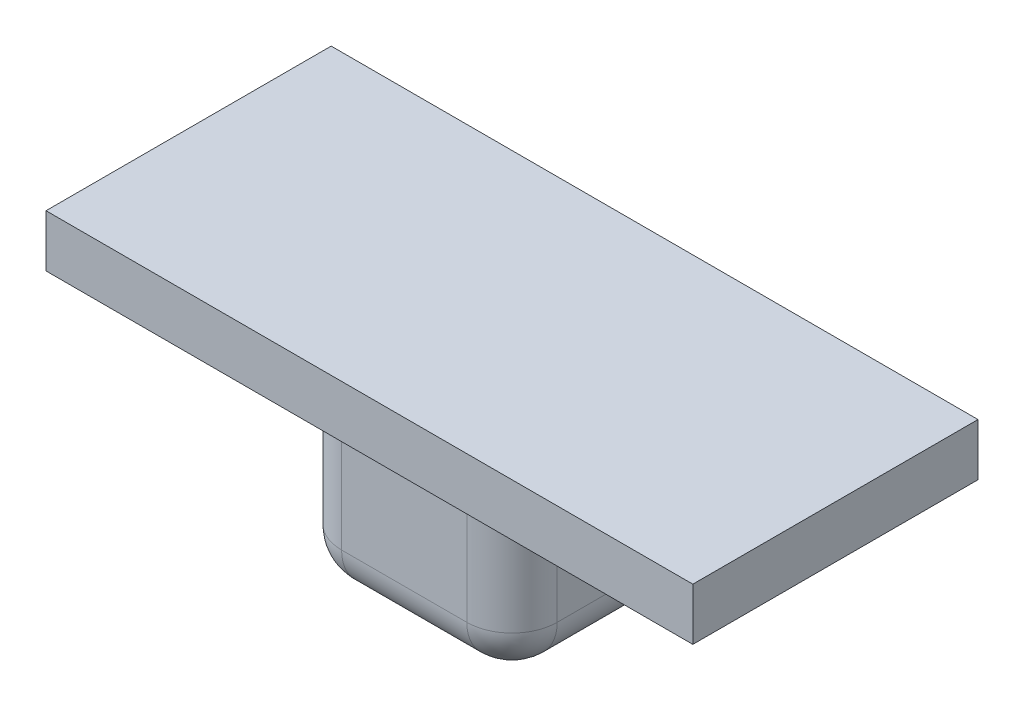
ISO-10303-21;
HEADER;
FILE_DESCRIPTION(('STEP AP214'),'2;1');
FILE_NAME('part.step','',(''),(''),'','','');
FILE_SCHEMA(('AUTOMOTIVE_DESIGN { 1 0 10303 214 1 1 1 1 }'));
ENDSEC;
DATA;
#1=APPLICATION_CONTEXT('core data for automotive mechanical design processes');
#2=APPLICATION_PROTOCOL_DEFINITION('international standard','automotive_design',2000,#1);
#3=PRODUCT_CONTEXT('',#1,'mechanical');
#4=PRODUCT('Part','Part','',(#3));
#5=PRODUCT_RELATED_PRODUCT_CATEGORY('part','',(#4));
#6=PRODUCT_DEFINITION_FORMATION('','',#4);
#7=PRODUCT_DEFINITION_CONTEXT('part definition',#1,'design');
#8=PRODUCT_DEFINITION('design','',#6,#7);
#9=PRODUCT_DEFINITION_SHAPE('','',#8);
#10=(LENGTH_UNIT() NAMED_UNIT(*) SI_UNIT(.MILLI.,.METRE.));
#11=(NAMED_UNIT(*) PLANE_ANGLE_UNIT() SI_UNIT($,.RADIAN.));
#12=(NAMED_UNIT(*) SI_UNIT($,.STERADIAN.) SOLID_ANGLE_UNIT());
#13=UNCERTAINTY_MEASURE_WITH_UNIT(LENGTH_MEASURE(1.E-05),#10,'distance_accuracy_value','');
#14=(GEOMETRIC_REPRESENTATION_CONTEXT(3) GLOBAL_UNCERTAINTY_ASSIGNED_CONTEXT((#13)) GLOBAL_UNIT_ASSIGNED_CONTEXT((#10,
#11,#12)) REPRESENTATION_CONTEXT('',''));
#15=CARTESIAN_POINT('',(0.,0.,0.));
#16=DIRECTION('',(0.,0.,1.));
#17=DIRECTION('',(1.,0.,0.));
#18=AXIS2_PLACEMENT_3D('',#15,#16,#17);
#19=CARTESIAN_POINT('',(0.,0.,0.));
#20=DIRECTION('',(0.,1.,0.));
#21=DIRECTION('',(0.,0.,1.));
#22=AXIS2_PLACEMENT_3D('',#19,#20,#21);
#23=PLANE('',#22);
#24=DIRECTION('',(0.,0.,1.));
#25=VECTOR('',#24,1.);
#26=CARTESIAN_POINT('',(-1.8,0.,0.));
#27=LINE('',#26,#25);
#28=CARTESIAN_POINT('',(-1.8,0.,1.8));
#29=VERTEX_POINT('',#28);
#30=CARTESIAN_POINT('',(-1.8,0.,-1.8));
#31=VERTEX_POINT('',#30);
#32=EDGE_CURVE('E265',#29,#31,#27,.F.);
#33=ORIENTED_EDGE('',*,*,#32,.T.);
#34=DIRECTION('',(-1.,0.,0.));
#35=VECTOR('',#34,1.);
#36=CARTESIAN_POINT('',(0.,0.,-1.8));
#37=LINE('',#36,#35);
#38=CARTESIAN_POINT('',(1.8,0.,-1.8));
#39=VERTEX_POINT('',#38);
#40=EDGE_CURVE('E270',#31,#39,#37,.F.);
#41=ORIENTED_EDGE('',*,*,#40,.T.);
#42=DIRECTION('',(0.,0.,-1.));
#43=VECTOR('',#42,1.);
#44=CARTESIAN_POINT('',(1.8,0.,0.));
#45=LINE('',#44,#43);
#46=CARTESIAN_POINT('',(1.8,0.,1.8));
#47=VERTEX_POINT('',#46);
#48=EDGE_CURVE('E60',#39,#47,#45,.F.);
#49=ORIENTED_EDGE('',*,*,#48,.T.);
#50=DIRECTION('',(1.,0.,0.));
#51=VECTOR('',#50,1.);
#52=CARTESIAN_POINT('',(0.,0.,1.8));
#53=LINE('',#52,#51);
#54=EDGE_CURVE('E267',#47,#29,#53,.F.);
#55=ORIENTED_EDGE('',*,*,#54,.T.);
#56=EDGE_LOOP('',(#33,#41,#49,#55));
#57=FACE_BOUND('',#56,.T.);
#58=DIRECTION('',(0.,0.,1.));
#59=VECTOR('',#58,1.);
#60=CARTESIAN_POINT('',(-1.6,0.,1.6));
#61=LINE('',#60,#59);
#62=CARTESIAN_POINT('',(-1.6,0.,-1.6));
#63=VERTEX_POINT('',#62);
#64=CARTESIAN_POINT('',(-1.6,0.,1.6));
#65=VERTEX_POINT('',#64);
#66=EDGE_CURVE('E189',#63,#65,#61,.T.);
#67=ORIENTED_EDGE('',*,*,#66,.T.);
#68=DIRECTION('',(1.,0.,0.));
#69=VECTOR('',#68,1.);
#70=CARTESIAN_POINT('',(1.6,0.,1.6));
#71=LINE('',#70,#69);
#72=CARTESIAN_POINT('',(1.6,0.,1.6));
#73=VERTEX_POINT('',#72);
#74=EDGE_CURVE('E192',#65,#73,#71,.T.);
#75=ORIENTED_EDGE('',*,*,#74,.T.);
#76=DIRECTION('',(0.,0.,-1.));
#77=VECTOR('',#76,1.);
#78=CARTESIAN_POINT('',(1.6,0.,1.6));
#79=LINE('',#78,#77);
#80=CARTESIAN_POINT('',(1.6,0.,-1.6));
#81=VERTEX_POINT('',#80);
#82=EDGE_CURVE('E214',#73,#81,#79,.T.);
#83=ORIENTED_EDGE('',*,*,#82,.T.);
#84=DIRECTION('',(-1.,0.,0.));
#85=VECTOR('',#84,1.);
#86=CARTESIAN_POINT('',(1.6,0.,-1.6));
#87=LINE('',#86,#85);
#88=EDGE_CURVE('E202',#81,#63,#87,.T.);
#89=ORIENTED_EDGE('',*,*,#88,.T.);
#90=EDGE_LOOP('',(#67,#75,#83,#89));
#91=FACE_BOUND('',#90,.T.);
#92=ADVANCED_FACE('F35',(#57,#91),#23,.F.);
#93=CARTESIAN_POINT('',(-3.1,5.,3.1));
#94=DIRECTION('',(1.,0.,0.));
#95=DIRECTION('',(0.,0.,-1.));
#96=AXIS2_PLACEMENT_3D('',#93,#94,#95);
#97=PLANE('',#96);
#98=DIRECTION('',(0.,0.,1.));
#99=VECTOR('',#98,1.);
#100=CARTESIAN_POINT('',(-3.1,5.,3.1));
#101=LINE('',#100,#99);
#102=CARTESIAN_POINT('',(-3.1,5.,-1.8));
#103=VERTEX_POINT('',#102);
#104=CARTESIAN_POINT('',(-3.1,5.,1.8));
#105=VERTEX_POINT('',#104);
#106=EDGE_CURVE('E228',#103,#105,#101,.T.);
#107=ORIENTED_EDGE('',*,*,#106,.F.);
#108=DIRECTION('',(0.,-1.,0.));
#109=VECTOR('',#108,1.);
#110=CARTESIAN_POINT('',(-3.1,5.,-1.8));
#111=LINE('',#110,#109);
#112=CARTESIAN_POINT('',(-3.1,1.3,-1.8));
#113=VERTEX_POINT('',#112);
#114=EDGE_CURVE('E263',#103,#113,#111,.T.);
#115=ORIENTED_EDGE('',*,*,#114,.T.);
#116=DIRECTION('',(0.,0.,1.));
#117=VECTOR('',#116,1.);
#118=CARTESIAN_POINT('',(-3.1,1.3,3.1));
#119=LINE('',#118,#117);
#120=CARTESIAN_POINT('',(-3.1,1.3,1.8));
#121=VERTEX_POINT('',#120);
#122=EDGE_CURVE('E259',#113,#121,#119,.T.);
#123=ORIENTED_EDGE('',*,*,#122,.T.);
#124=DIRECTION('',(0.,-1.,0.));
#125=VECTOR('',#124,1.);
#126=CARTESIAN_POINT('',(-3.1,5.,1.8));
#127=LINE('',#126,#125);
#128=EDGE_CURVE('E261',#121,#105,#127,.F.);
#129=ORIENTED_EDGE('',*,*,#128,.T.);
#130=EDGE_LOOP('',(#107,#115,#123,#129));
#131=FACE_BOUND('',#130,.T.);
#132=ADVANCED_FACE('F342',(#131),#97,.F.);
#133=CARTESIAN_POINT('',(3.1,5.,3.1));
#134=DIRECTION('',(0.,0.,-1.));
#135=DIRECTION('',(-1.,0.,0.));
#136=AXIS2_PLACEMENT_3D('',#133,#134,#135);
#137=PLANE('',#136);
#138=DIRECTION('',(1.,0.,0.));
#139=VECTOR('',#138,1.);
#140=CARTESIAN_POINT('',(3.1,1.3,3.1));
#141=LINE('',#140,#139);
#142=CARTESIAN_POINT('',(-1.8,1.3,3.1));
#143=VERTEX_POINT('',#142);
#144=CARTESIAN_POINT('',(1.8,1.3,3.1));
#145=VERTEX_POINT('',#144);
#146=EDGE_CURVE('E253',#143,#145,#141,.T.);
#147=ORIENTED_EDGE('',*,*,#146,.T.);
#148=DIRECTION('',(0.,-1.,0.));
#149=VECTOR('',#148,1.);
#150=CARTESIAN_POINT('',(1.8,5.,3.1));
#151=LINE('',#150,#149);
#152=CARTESIAN_POINT('',(1.8,5.,3.1));
#153=VERTEX_POINT('',#152);
#154=EDGE_CURVE('E257',#145,#153,#151,.F.);
#155=ORIENTED_EDGE('',*,*,#154,.T.);
#156=DIRECTION('',(1.,0.,0.));
#157=VECTOR('',#156,1.);
#158=CARTESIAN_POINT('',(3.1,5.,3.1));
#159=LINE('',#158,#157);
#160=CARTESIAN_POINT('',(-1.8,5.,3.1));
#161=VERTEX_POINT('',#160);
#162=EDGE_CURVE('E231',#161,#153,#159,.T.);
#163=ORIENTED_EDGE('',*,*,#162,.F.);
#164=DIRECTION('',(0.,-1.,0.));
#165=VECTOR('',#164,1.);
#166=CARTESIAN_POINT('',(-1.8,5.,3.1));
#167=LINE('',#166,#165);
#168=EDGE_CURVE('E255',#161,#143,#167,.T.);
#169=ORIENTED_EDGE('',*,*,#168,.T.);
#170=EDGE_LOOP('',(#147,#155,#163,#169));
#171=FACE_BOUND('',#170,.T.);
#172=ADVANCED_FACE('F347',(#171),#137,.F.);
#173=CARTESIAN_POINT('',(3.1,5.,3.1));
#174=DIRECTION('',(-1.,0.,0.));
#175=DIRECTION('',(0.,0.,1.));
#176=AXIS2_PLACEMENT_3D('',#173,#174,#175);
#177=PLANE('',#176);
#178=DIRECTION('',(0.,0.,-1.));
#179=VECTOR('',#178,1.);
#180=CARTESIAN_POINT('',(3.1,1.3,3.1));
#181=LINE('',#180,#179);
#182=CARTESIAN_POINT('',(3.1,1.3,1.8));
#183=VERTEX_POINT('',#182);
#184=CARTESIAN_POINT('',(3.1,1.3,-1.8));
#185=VERTEX_POINT('',#184);
#186=EDGE_CURVE('E247',#183,#185,#181,.T.);
#187=ORIENTED_EDGE('',*,*,#186,.T.);
#188=DIRECTION('',(0.,-1.,0.));
#189=VECTOR('',#188,1.);
#190=CARTESIAN_POINT('',(3.1,5.,-1.8));
#191=LINE('',#190,#189);
#192=CARTESIAN_POINT('',(3.1,5.,-1.8));
#193=VERTEX_POINT('',#192);
#194=EDGE_CURVE('E251',#185,#193,#191,.F.);
#195=ORIENTED_EDGE('',*,*,#194,.T.);
#196=DIRECTION('',(0.,0.,-1.));
#197=VECTOR('',#196,1.);
#198=CARTESIAN_POINT('',(3.1,5.,3.1));
#199=LINE('',#198,#197);
#200=CARTESIAN_POINT('',(3.1,5.,1.8));
#201=VERTEX_POINT('',#200);
#202=EDGE_CURVE('E234',#201,#193,#199,.T.);
#203=ORIENTED_EDGE('',*,*,#202,.F.);
#204=DIRECTION('',(0.,-1.,0.));
#205=VECTOR('',#204,1.);
#206=CARTESIAN_POINT('',(3.1,5.,1.8));
#207=LINE('',#206,#205);
#208=EDGE_CURVE('E249',#201,#183,#207,.T.);
#209=ORIENTED_EDGE('',*,*,#208,.T.);
#210=EDGE_LOOP('',(#187,#195,#203,#209));
#211=FACE_BOUND('',#210,.T.);
#212=ADVANCED_FACE('F358',(#211),#177,.F.);
#213=CARTESIAN_POINT('',(3.1,5.,-3.1));
#214=DIRECTION('',(0.,0.,1.));
#215=DIRECTION('',(1.,0.,0.));
#216=AXIS2_PLACEMENT_3D('',#213,#214,#215);
#217=PLANE('',#216);
#218=DIRECTION('',(-1.,0.,0.));
#219=VECTOR('',#218,1.);
#220=CARTESIAN_POINT('',(3.1,5.,-3.1));
#221=LINE('',#220,#219);
#222=CARTESIAN_POINT('',(1.8,5.,-3.1));
#223=VERTEX_POINT('',#222);
#224=CARTESIAN_POINT('',(-1.8,5.,-3.1));
#225=VERTEX_POINT('',#224);
#226=EDGE_CURVE('E237',#223,#225,#221,.T.);
#227=ORIENTED_EDGE('',*,*,#226,.F.);
#228=DIRECTION('',(0.,-1.,0.));
#229=VECTOR('',#228,1.);
#230=CARTESIAN_POINT('',(1.8,5.,-3.1));
#231=LINE('',#230,#229);
#232=CARTESIAN_POINT('',(1.8,1.3,-3.1));
#233=VERTEX_POINT('',#232);
#234=EDGE_CURVE('E244',#223,#233,#231,.T.);
#235=ORIENTED_EDGE('',*,*,#234,.T.);
#236=DIRECTION('',(-1.,0.,0.));
#237=VECTOR('',#236,1.);
#238=CARTESIAN_POINT('',(3.1,1.3,-3.1));
#239=LINE('',#238,#237);
#240=CARTESIAN_POINT('',(-1.8,1.3,-3.1));
#241=VERTEX_POINT('',#240);
#242=EDGE_CURVE('E240',#233,#241,#239,.T.);
#243=ORIENTED_EDGE('',*,*,#242,.T.);
#244=DIRECTION('',(0.,-1.,0.));
#245=VECTOR('',#244,1.);
#246=CARTESIAN_POINT('',(-1.8,5.,-3.1));
#247=LINE('',#246,#245);
#248=EDGE_CURVE('E242',#241,#225,#247,.F.);
#249=ORIENTED_EDGE('',*,*,#248,.T.);
#250=EDGE_LOOP('',(#227,#235,#243,#249));
#251=FACE_BOUND('',#250,.T.);
#252=ADVANCED_FACE('F355',(#251),#217,.F.);
#253=CARTESIAN_POINT('',(-1.6,5.,1.6));
#254=DIRECTION('',(1.,0.,0.));
#255=DIRECTION('',(0.,0.,-1.));
#256=AXIS2_PLACEMENT_3D('',#253,#254,#255);
#257=PLANE('',#256);
#258=ORIENTED_EDGE('',*,*,#66,.F.);
#259=DIRECTION('',(0.,-1.,0.));
#260=VECTOR('',#259,1.);
#261=CARTESIAN_POINT('',(-1.6,5.,-1.6));
#262=LINE('',#261,#260);
#263=CARTESIAN_POINT('',(-1.6,5.,-1.6));
#264=VERTEX_POINT('',#263);
#265=EDGE_CURVE('E210',#264,#63,#262,.T.);
#266=ORIENTED_EDGE('',*,*,#265,.F.);
#267=DIRECTION('',(0.,0.,1.));
#268=VECTOR('',#267,1.);
#269=CARTESIAN_POINT('',(-1.6,5.,1.6));
#270=LINE('',#269,#268);
#271=CARTESIAN_POINT('',(-1.6,5.,1.6));
#272=VERTEX_POINT('',#271);
#273=EDGE_CURVE('E198',#264,#272,#270,.T.);
#274=ORIENTED_EDGE('',*,*,#273,.T.);
#275=DIRECTION('',(0.,-1.,0.));
#276=VECTOR('',#275,1.);
#277=CARTESIAN_POINT('',(-1.6,5.,1.6));
#278=LINE('',#277,#276);
#279=EDGE_CURVE('E225',#272,#65,#278,.T.);
#280=ORIENTED_EDGE('',*,*,#279,.T.);
#281=EDGE_LOOP('',(#258,#266,#274,#280));
#282=FACE_BOUND('',#281,.T.);
#283=ADVANCED_FACE('F353',(#282),#257,.T.);
#284=CARTESIAN_POINT('',(1.6,5.,1.6));
#285=DIRECTION('',(0.,0.,-1.));
#286=DIRECTION('',(-1.,0.,0.));
#287=AXIS2_PLACEMENT_3D('',#284,#285,#286);
#288=PLANE('',#287);
#289=ORIENTED_EDGE('',*,*,#74,.F.);
#290=ORIENTED_EDGE('',*,*,#279,.F.);
#291=DIRECTION('',(1.,0.,0.));
#292=VECTOR('',#291,1.);
#293=CARTESIAN_POINT('',(1.6,5.,1.6));
#294=LINE('',#293,#292);
#295=CARTESIAN_POINT('',(1.6,5.,1.6));
#296=VERTEX_POINT('',#295);
#297=EDGE_CURVE('E201',#272,#296,#294,.T.);
#298=ORIENTED_EDGE('',*,*,#297,.T.);
#299=DIRECTION('',(0.,-1.,0.));
#300=VECTOR('',#299,1.);
#301=CARTESIAN_POINT('',(1.6,5.,1.6));
#302=LINE('',#301,#300);
#303=EDGE_CURVE('E223',#296,#73,#302,.T.);
#304=ORIENTED_EDGE('',*,*,#303,.T.);
#305=EDGE_LOOP('',(#289,#290,#298,#304));
#306=FACE_BOUND('',#305,.T.);
#307=ADVANCED_FACE('F562',(#306),#288,.T.);
#308=CARTESIAN_POINT('',(1.6,5.,1.6));
#309=DIRECTION('',(-1.,0.,0.));
#310=DIRECTION('',(0.,0.,1.));
#311=AXIS2_PLACEMENT_3D('',#308,#309,#310);
#312=PLANE('',#311);
#313=ORIENTED_EDGE('',*,*,#82,.F.);
#314=ORIENTED_EDGE('',*,*,#303,.F.);
#315=DIRECTION('',(0.,0.,-1.));
#316=VECTOR('',#315,1.);
#317=CARTESIAN_POINT('',(1.6,5.,1.6));
#318=LINE('',#317,#316);
#319=CARTESIAN_POINT('',(1.6,5.,-1.6));
#320=VERTEX_POINT('',#319);
#321=EDGE_CURVE('E205',#296,#320,#318,.T.);
#322=ORIENTED_EDGE('',*,*,#321,.T.);
#323=DIRECTION('',(0.,-1.,0.));
#324=VECTOR('',#323,1.);
#325=CARTESIAN_POINT('',(1.6,5.,-1.6));
#326=LINE('',#325,#324);
#327=EDGE_CURVE('E221',#320,#81,#326,.T.);
#328=ORIENTED_EDGE('',*,*,#327,.T.);
#329=EDGE_LOOP('',(#313,#314,#322,#328));
#330=FACE_BOUND('',#329,.T.);
#331=ADVANCED_FACE('F568',(#330),#312,.T.);
#332=CARTESIAN_POINT('',(1.6,5.,-1.6));
#333=DIRECTION('',(0.,0.,1.));
#334=DIRECTION('',(1.,0.,0.));
#335=AXIS2_PLACEMENT_3D('',#332,#333,#334);
#336=PLANE('',#335);
#337=ORIENTED_EDGE('',*,*,#88,.F.);
#338=ORIENTED_EDGE('',*,*,#327,.F.);
#339=DIRECTION('',(-1.,0.,0.));
#340=VECTOR('',#339,1.);
#341=CARTESIAN_POINT('',(1.6,5.,-1.6));
#342=LINE('',#341,#340);
#343=EDGE_CURVE('E208',#320,#264,#342,.T.);
#344=ORIENTED_EDGE('',*,*,#343,.T.);
#345=ORIENTED_EDGE('',*,*,#265,.T.);
#346=EDGE_LOOP('',(#337,#338,#344,#345));
#347=FACE_BOUND('',#346,.T.);
#348=ADVANCED_FACE('F443',(#347),#336,.T.);
#349=CARTESIAN_POINT('',(0.,5.,0.));
#350=DIRECTION('',(0.,1.,0.));
#351=DIRECTION('',(0.,0.,1.));
#352=AXIS2_PLACEMENT_3D('',#349,#350,#351);
#353=PLANE('',#352);
#354=ORIENTED_EDGE('',*,*,#273,.F.);
#355=ORIENTED_EDGE('',*,*,#343,.F.);
#356=ORIENTED_EDGE('',*,*,#321,.F.);
#357=ORIENTED_EDGE('',*,*,#297,.F.);
#358=EDGE_LOOP('',(#354,#355,#356,#357));
#359=FACE_BOUND('',#358,.T.);
#360=ADVANCED_FACE('F436',(#359),#353,.F.);
#361=DIRECTION('',(0.,0.,1.));
#362=VECTOR('',#361,1.);
#363=CARTESIAN_POINT('',(-9.3,5.,4.1));
#364=LINE('',#363,#362);
#365=CARTESIAN_POINT('',(-9.3,5.,-4.1));
#366=VERTEX_POINT('',#365);
#367=CARTESIAN_POINT('',(-9.3,5.,4.1));
#368=VERTEX_POINT('',#367);
#369=EDGE_CURVE('E188',#366,#368,#364,.T.);
#370=ORIENTED_EDGE('',*,*,#369,.F.);
#371=DIRECTION('',(-1.,0.,0.));
#372=VECTOR('',#371,1.);
#373=CARTESIAN_POINT('',(9.3,5.,-4.1));
#374=LINE('',#373,#372);
#375=CARTESIAN_POINT('',(9.3,5.,-4.1));
#376=VERTEX_POINT('',#375);
#377=EDGE_CURVE('E184',#376,#366,#374,.T.);
#378=ORIENTED_EDGE('',*,*,#377,.F.);
#379=DIRECTION('',(0.,0.,-1.));
#380=VECTOR('',#379,1.);
#381=CARTESIAN_POINT('',(9.3,5.,4.1));
#382=LINE('',#381,#380);
#383=CARTESIAN_POINT('',(9.3,5.,4.1));
#384=VERTEX_POINT('',#383);
#385=EDGE_CURVE('E314',#384,#376,#382,.T.);
#386=ORIENTED_EDGE('',*,*,#385,.F.);
#387=DIRECTION('',(1.,0.,0.));
#388=VECTOR('',#387,1.);
#389=CARTESIAN_POINT('',(9.3,5.,4.1));
#390=LINE('',#389,#388);
#391=EDGE_CURVE('E312',#368,#384,#390,.T.);
#392=ORIENTED_EDGE('',*,*,#391,.F.);
#393=EDGE_LOOP('',(#370,#378,#386,#392));
#394=FACE_BOUND('',#393,.T.);
#395=ORIENTED_EDGE('',*,*,#202,.T.);
#396=CARTESIAN_POINT('',(1.8,5.,-1.8));
#397=DIRECTION('',(0.,1.,0.));
#398=DIRECTION('',(0.,0.,1.));
#399=AXIS2_PLACEMENT_3D('',#396,#397,#398);
#400=CIRCLE('',#399,1.3);
#401=EDGE_CURVE('E272',#193,#223,#400,.T.);
#402=ORIENTED_EDGE('',*,*,#401,.T.);
#403=ORIENTED_EDGE('',*,*,#226,.T.);
#404=CARTESIAN_POINT('',(-1.8,5.,-1.8));
#405=DIRECTION('',(0.,1.,0.));
#406=DIRECTION('',(0.,0.,1.));
#407=AXIS2_PLACEMENT_3D('',#404,#405,#406);
#408=CIRCLE('',#407,1.3);
#409=EDGE_CURVE('E44',#225,#103,#408,.T.);
#410=ORIENTED_EDGE('',*,*,#409,.T.);
#411=ORIENTED_EDGE('',*,*,#106,.T.);
#412=CARTESIAN_POINT('',(-1.8,5.,1.8));
#413=DIRECTION('',(0.,1.,0.));
#414=DIRECTION('',(0.,0.,1.));
#415=AXIS2_PLACEMENT_3D('',#412,#413,#414);
#416=CIRCLE('',#415,1.3);
#417=EDGE_CURVE('E11',#105,#161,#416,.T.);
#418=ORIENTED_EDGE('',*,*,#417,.T.);
#419=ORIENTED_EDGE('',*,*,#162,.T.);
#420=CARTESIAN_POINT('',(1.8,5.,1.8));
#421=DIRECTION('',(0.,1.,0.));
#422=DIRECTION('',(0.,0.,1.));
#423=AXIS2_PLACEMENT_3D('',#420,#421,#422);
#424=CIRCLE('',#423,1.3);
#425=EDGE_CURVE('E274',#153,#201,#424,.T.);
#426=ORIENTED_EDGE('',*,*,#425,.T.);
#427=EDGE_LOOP('',(#395,#402,#403,#410,#411,#418,#419,#426));
#428=FACE_BOUND('',#427,.T.);
#429=ADVANCED_FACE('F330',(#394,#428),#353,.F.);
#430=CARTESIAN_POINT('',(-9.3,6.5,4.1));
#431=DIRECTION('',(1.,0.,0.));
#432=DIRECTION('',(0.,0.,-1.));
#433=AXIS2_PLACEMENT_3D('',#430,#431,#432);
#434=PLANE('',#433);
#435=ORIENTED_EDGE('',*,*,#369,.T.);
#436=DIRECTION('',(0.,-1.,0.));
#437=VECTOR('',#436,1.);
#438=CARTESIAN_POINT('',(-9.3,6.5,4.1));
#439=LINE('',#438,#437);
#440=CARTESIAN_POINT('',(-9.3,6.5,4.1));
#441=VERTEX_POINT('',#440);
#442=EDGE_CURVE('E168',#441,#368,#439,.T.);
#443=ORIENTED_EDGE('',*,*,#442,.F.);
#444=DIRECTION('',(0.,0.,1.));
#445=VECTOR('',#444,1.);
#446=CARTESIAN_POINT('',(-9.3,6.5,4.1));
#447=LINE('',#446,#445);
#448=CARTESIAN_POINT('',(-9.3,6.5,-4.1));
#449=VERTEX_POINT('',#448);
#450=EDGE_CURVE('E175',#449,#441,#447,.T.);
#451=ORIENTED_EDGE('',*,*,#450,.F.);
#452=DIRECTION('',(0.,-1.,0.));
#453=VECTOR('',#452,1.);
#454=CARTESIAN_POINT('',(-9.3,6.5,-4.1));
#455=LINE('',#454,#453);
#456=EDGE_CURVE('E321',#449,#366,#455,.T.);
#457=ORIENTED_EDGE('',*,*,#456,.T.);
#458=EDGE_LOOP('',(#435,#443,#451,#457));
#459=FACE_BOUND('',#458,.T.);
#460=ADVANCED_FACE('F186',(#459),#434,.F.);
#461=CARTESIAN_POINT('',(9.3,6.5,4.1));
#462=DIRECTION('',(0.,0.,-1.));
#463=DIRECTION('',(-1.,0.,0.));
#464=AXIS2_PLACEMENT_3D('',#461,#462,#463);
#465=PLANE('',#464);
#466=ORIENTED_EDGE('',*,*,#391,.T.);
#467=DIRECTION('',(0.,-1.,0.));
#468=VECTOR('',#467,1.);
#469=CARTESIAN_POINT('',(9.3,6.5,4.1));
#470=LINE('',#469,#468);
#471=CARTESIAN_POINT('',(9.3,6.5,4.1));
#472=VERTEX_POINT('',#471);
#473=EDGE_CURVE('E171',#472,#384,#470,.T.);
#474=ORIENTED_EDGE('',*,*,#473,.F.);
#475=DIRECTION('',(1.,0.,0.));
#476=VECTOR('',#475,1.);
#477=CARTESIAN_POINT('',(9.3,6.5,4.1));
#478=LINE('',#477,#476);
#479=EDGE_CURVE('E164',#441,#472,#478,.T.);
#480=ORIENTED_EDGE('',*,*,#479,.F.);
#481=ORIENTED_EDGE('',*,*,#442,.T.);
#482=EDGE_LOOP('',(#466,#474,#480,#481));
#483=FACE_BOUND('',#482,.T.);
#484=ADVANCED_FACE('F166',(#483),#465,.F.);
#485=CARTESIAN_POINT('',(9.3,6.5,4.1));
#486=DIRECTION('',(-1.,0.,0.));
#487=DIRECTION('',(0.,0.,1.));
#488=AXIS2_PLACEMENT_3D('',#485,#486,#487);
#489=PLANE('',#488);
#490=ORIENTED_EDGE('',*,*,#385,.T.);
#491=DIRECTION('',(0.,-1.,0.));
#492=VECTOR('',#491,1.);
#493=CARTESIAN_POINT('',(9.3,6.5,-4.1));
#494=LINE('',#493,#492);
#495=CARTESIAN_POINT('',(9.3,6.5,-4.1));
#496=VERTEX_POINT('',#495);
#497=EDGE_CURVE('E194',#496,#376,#494,.T.);
#498=ORIENTED_EDGE('',*,*,#497,.F.);
#499=DIRECTION('',(0.,0.,-1.));
#500=VECTOR('',#499,1.);
#501=CARTESIAN_POINT('',(9.3,6.5,4.1));
#502=LINE('',#501,#500);
#503=EDGE_CURVE('E174',#472,#496,#502,.T.);
#504=ORIENTED_EDGE('',*,*,#503,.F.);
#505=ORIENTED_EDGE('',*,*,#473,.T.);
#506=EDGE_LOOP('',(#490,#498,#504,#505));
#507=FACE_BOUND('',#506,.T.);
#508=ADVANCED_FACE('F332',(#507),#489,.F.);
#509=CARTESIAN_POINT('',(9.3,6.5,-4.1));
#510=DIRECTION('',(0.,0.,1.));
#511=DIRECTION('',(1.,0.,0.));
#512=AXIS2_PLACEMENT_3D('',#509,#510,#511);
#513=PLANE('',#512);
#514=ORIENTED_EDGE('',*,*,#377,.T.);
#515=ORIENTED_EDGE('',*,*,#456,.F.);
#516=DIRECTION('',(-1.,0.,0.));
#517=VECTOR('',#516,1.);
#518=CARTESIAN_POINT('',(9.3,6.5,-4.1));
#519=LINE('',#518,#517);
#520=EDGE_CURVE('E180',#496,#449,#519,.T.);
#521=ORIENTED_EDGE('',*,*,#520,.F.);
#522=ORIENTED_EDGE('',*,*,#497,.T.);
#523=EDGE_LOOP('',(#514,#515,#521,#522));
#524=FACE_BOUND('',#523,.T.);
#525=ADVANCED_FACE('F326',(#524),#513,.F.);
#526=CARTESIAN_POINT('',(0.,6.5,0.));
#527=DIRECTION('',(0.,1.,0.));
#528=DIRECTION('',(0.,0.,1.));
#529=AXIS2_PLACEMENT_3D('',#526,#527,#528);
#530=PLANE('',#529);
#531=ORIENTED_EDGE('',*,*,#450,.T.);
#532=ORIENTED_EDGE('',*,*,#479,.T.);
#533=ORIENTED_EDGE('',*,*,#503,.T.);
#534=ORIENTED_EDGE('',*,*,#520,.T.);
#535=EDGE_LOOP('',(#531,#532,#533,#534));
#536=FACE_BOUND('',#535,.T.);
#537=ADVANCED_FACE('F178',(#536),#530,.T.);
#538=CARTESIAN_POINT('',(-1.8,5.,1.8));
#539=DIRECTION('',(0.,-1.,0.));
#540=DIRECTION('',(0.,0.,-1.));
#541=AXIS2_PLACEMENT_3D('',#538,#539,#540);
#542=CYLINDRICAL_SURFACE('',#541,1.3);
#543=CARTESIAN_POINT('',(-1.8,1.3,1.8));
#544=DIRECTION('',(0.,-1.,0.));
#545=DIRECTION('',(0.,0.,-1.));
#546=AXIS2_PLACEMENT_3D('',#543,#544,#545);
#547=CIRCLE('',#546,1.3);
#548=EDGE_CURVE('E39',#143,#121,#547,.T.);
#549=ORIENTED_EDGE('',*,*,#548,.F.);
#550=ORIENTED_EDGE('',*,*,#168,.F.);
#551=ORIENTED_EDGE('',*,*,#417,.F.);
#552=ORIENTED_EDGE('',*,*,#128,.F.);
#553=EDGE_LOOP('',(#549,#550,#551,#552));
#554=FACE_BOUND('',#553,.T.);
#555=ADVANCED_FACE('F37',(#554),#542,.T.);
#556=CARTESIAN_POINT('',(-1.8,1.3,1.8));
#557=DIRECTION('',(0.,0.,1.));
#558=DIRECTION('',(1.,0.,0.));
#559=AXIS2_PLACEMENT_3D('',#556,#557,#558);
#560=SPHERICAL_SURFACE('',#559,1.3);
#561=CARTESIAN_POINT('',(-1.8,1.3,1.8));
#562=DIRECTION('',(-1.,0.,0.));
#563=DIRECTION('',(0.,0.,1.));
#564=AXIS2_PLACEMENT_3D('',#561,#562,#563);
#565=CIRCLE('',#564,1.3);
#566=EDGE_CURVE('E300',#143,#29,#565,.F.);
#567=ORIENTED_EDGE('',*,*,#566,.F.);
#568=ORIENTED_EDGE('',*,*,#548,.T.);
#569=CARTESIAN_POINT('',(-1.8,1.3,1.8));
#570=DIRECTION('',(0.,0.,1.));
#571=DIRECTION('',(1.,0.,0.));
#572=AXIS2_PLACEMENT_3D('',#569,#570,#571);
#573=CIRCLE('',#572,1.3);
#574=EDGE_CURVE('E302',#29,#121,#573,.F.);
#575=ORIENTED_EDGE('',*,*,#574,.F.);
#576=EDGE_LOOP('',(#567,#568,#575));
#577=FACE_BOUND('',#576,.T.);
#578=ADVANCED_FACE('F402',(#577),#560,.T.);
#579=CARTESIAN_POINT('',(-1.8,5.,-1.8));
#580=DIRECTION('',(0.,-1.,0.));
#581=DIRECTION('',(0.,0.,-1.));
#582=AXIS2_PLACEMENT_3D('',#579,#580,#581);
#583=CYLINDRICAL_SURFACE('',#582,1.3);
#584=ORIENTED_EDGE('',*,*,#409,.F.);
#585=ORIENTED_EDGE('',*,*,#248,.F.);
#586=CARTESIAN_POINT('',(-1.8,1.3,-1.8));
#587=DIRECTION('',(0.,-1.,0.));
#588=DIRECTION('',(0.,0.,-1.));
#589=AXIS2_PLACEMENT_3D('',#586,#587,#588);
#590=CIRCLE('',#589,1.3);
#591=EDGE_CURVE('E297',#113,#241,#590,.T.);
#592=ORIENTED_EDGE('',*,*,#591,.F.);
#593=ORIENTED_EDGE('',*,*,#114,.F.);
#594=EDGE_LOOP('',(#584,#585,#592,#593));
#595=FACE_BOUND('',#594,.T.);
#596=ADVANCED_FACE('F400',(#595),#583,.T.);
#597=CARTESIAN_POINT('',(-1.8,1.3,3.1));
#598=DIRECTION('',(0.,0.,1.));
#599=DIRECTION('',(1.,0.,0.));
#600=AXIS2_PLACEMENT_3D('',#597,#598,#599);
#601=CYLINDRICAL_SURFACE('',#600,1.3);
#602=ORIENTED_EDGE('',*,*,#574,.T.);
#603=ORIENTED_EDGE('',*,*,#122,.F.);
#604=CARTESIAN_POINT('',(-1.8,1.3,-1.8));
#605=DIRECTION('',(0.,0.,-1.));
#606=DIRECTION('',(-1.,0.,0.));
#607=AXIS2_PLACEMENT_3D('',#604,#605,#606);
#608=CIRCLE('',#607,1.3);
#609=EDGE_CURVE('E294',#31,#113,#608,.T.);
#610=ORIENTED_EDGE('',*,*,#609,.F.);
#611=ORIENTED_EDGE('',*,*,#32,.F.);
#612=EDGE_LOOP('',(#602,#603,#610,#611));
#613=FACE_BOUND('',#612,.T.);
#614=ADVANCED_FACE('F396',(#613),#601,.T.);
#615=CARTESIAN_POINT('',(3.1,1.3,1.8));
#616=DIRECTION('',(1.,0.,0.));
#617=DIRECTION('',(0.,0.,-1.));
#618=AXIS2_PLACEMENT_3D('',#615,#616,#617);
#619=CYLINDRICAL_SURFACE('',#618,1.3);
#620=ORIENTED_EDGE('',*,*,#566,.T.);
#621=ORIENTED_EDGE('',*,*,#54,.F.);
#622=CARTESIAN_POINT('',(1.8,1.3,1.8));
#623=DIRECTION('',(1.,0.,0.));
#624=DIRECTION('',(0.,0.,-1.));
#625=AXIS2_PLACEMENT_3D('',#622,#623,#624);
#626=CIRCLE('',#625,1.3);
#627=EDGE_CURVE('E291',#145,#47,#626,.T.);
#628=ORIENTED_EDGE('',*,*,#627,.F.);
#629=ORIENTED_EDGE('',*,*,#146,.F.);
#630=EDGE_LOOP('',(#620,#621,#628,#629));
#631=FACE_BOUND('',#630,.T.);
#632=ADVANCED_FACE('F392',(#631),#619,.T.);
#633=CARTESIAN_POINT('',(1.8,5.,1.8));
#634=DIRECTION('',(0.,-1.,0.));
#635=DIRECTION('',(0.,0.,-1.));
#636=AXIS2_PLACEMENT_3D('',#633,#634,#635);
#637=CYLINDRICAL_SURFACE('',#636,1.3);
#638=ORIENTED_EDGE('',*,*,#425,.F.);
#639=ORIENTED_EDGE('',*,*,#154,.F.);
#640=CARTESIAN_POINT('',(1.8,1.3,1.8));
#641=DIRECTION('',(0.,-1.,0.));
#642=DIRECTION('',(0.,0.,-1.));
#643=AXIS2_PLACEMENT_3D('',#640,#641,#642);
#644=CIRCLE('',#643,1.3);
#645=EDGE_CURVE('E288',#183,#145,#644,.T.);
#646=ORIENTED_EDGE('',*,*,#645,.F.);
#647=ORIENTED_EDGE('',*,*,#208,.F.);
#648=EDGE_LOOP('',(#638,#639,#646,#647));
#649=FACE_BOUND('',#648,.T.);
#650=ADVANCED_FACE('F388',(#649),#637,.T.);
#651=CARTESIAN_POINT('',(-1.8,1.3,-1.8));
#652=DIRECTION('',(0.,0.,1.));
#653=DIRECTION('',(1.,0.,0.));
#654=AXIS2_PLACEMENT_3D('',#651,#652,#653);
#655=SPHERICAL_SURFACE('',#654,1.3);
#656=ORIENTED_EDGE('',*,*,#609,.T.);
#657=ORIENTED_EDGE('',*,*,#591,.T.);
#658=CARTESIAN_POINT('',(-1.8,1.3,-1.8));
#659=DIRECTION('',(-1.,0.,0.));
#660=DIRECTION('',(0.,0.,1.));
#661=AXIS2_PLACEMENT_3D('',#658,#659,#660);
#662=CIRCLE('',#661,1.3);
#663=EDGE_CURVE('E285',#31,#241,#662,.F.);
#664=ORIENTED_EDGE('',*,*,#663,.F.);
#665=EDGE_LOOP('',(#656,#657,#664));
#666=FACE_BOUND('',#665,.T.);
#667=ADVANCED_FACE('F384',(#666),#655,.T.);
#668=CARTESIAN_POINT('',(1.8,1.3,1.8));
#669=DIRECTION('',(0.,0.,1.));
#670=DIRECTION('',(1.,0.,0.));
#671=AXIS2_PLACEMENT_3D('',#668,#669,#670);
#672=SPHERICAL_SURFACE('',#671,1.3);
#673=ORIENTED_EDGE('',*,*,#645,.T.);
#674=ORIENTED_EDGE('',*,*,#627,.T.);
#675=CARTESIAN_POINT('',(1.8,1.3,1.8));
#676=DIRECTION('',(0.,0.,1.));
#677=DIRECTION('',(1.,0.,0.));
#678=AXIS2_PLACEMENT_3D('',#675,#676,#677);
#679=CIRCLE('',#678,1.3);
#680=EDGE_CURVE('E282',#183,#47,#679,.F.);
#681=ORIENTED_EDGE('',*,*,#680,.F.);
#682=EDGE_LOOP('',(#673,#674,#681));
#683=FACE_BOUND('',#682,.T.);
#684=ADVANCED_FACE('F380',(#683),#672,.T.);
#685=CARTESIAN_POINT('',(3.1,1.3,-1.8));
#686=DIRECTION('',(-1.,0.,0.));
#687=DIRECTION('',(0.,0.,1.));
#688=AXIS2_PLACEMENT_3D('',#685,#686,#687);
#689=CYLINDRICAL_SURFACE('',#688,1.3);
#690=ORIENTED_EDGE('',*,*,#663,.T.);
#691=ORIENTED_EDGE('',*,*,#242,.F.);
#692=CARTESIAN_POINT('',(1.8,1.3,-1.8));
#693=DIRECTION('',(1.,0.,0.));
#694=DIRECTION('',(0.,0.,-1.));
#695=AXIS2_PLACEMENT_3D('',#692,#693,#694);
#696=CIRCLE('',#695,1.3);
#697=EDGE_CURVE('E280',#39,#233,#696,.T.);
#698=ORIENTED_EDGE('',*,*,#697,.F.);
#699=ORIENTED_EDGE('',*,*,#40,.F.);
#700=EDGE_LOOP('',(#690,#691,#698,#699));
#701=FACE_BOUND('',#700,.T.);
#702=ADVANCED_FACE('F376',(#701),#689,.T.);
#703=CARTESIAN_POINT('',(1.8,1.3,3.1));
#704=DIRECTION('',(0.,0.,-1.));
#705=DIRECTION('',(-1.,0.,0.));
#706=AXIS2_PLACEMENT_3D('',#703,#704,#705);
#707=CYLINDRICAL_SURFACE('',#706,1.3);
#708=ORIENTED_EDGE('',*,*,#680,.T.);
#709=ORIENTED_EDGE('',*,*,#48,.F.);
#710=CARTESIAN_POINT('',(1.8,1.3,-1.8));
#711=DIRECTION('',(0.,0.,-1.));
#712=DIRECTION('',(-1.,0.,0.));
#713=AXIS2_PLACEMENT_3D('',#710,#711,#712);
#714=CIRCLE('',#713,1.3);
#715=EDGE_CURVE('E52',#185,#39,#714,.T.);
#716=ORIENTED_EDGE('',*,*,#715,.F.);
#717=ORIENTED_EDGE('',*,*,#186,.F.);
#718=EDGE_LOOP('',(#708,#709,#716,#717));
#719=FACE_BOUND('',#718,.T.);
#720=ADVANCED_FACE('F373',(#719),#707,.T.);
#721=CARTESIAN_POINT('',(1.8,1.3,-1.8));
#722=DIRECTION('',(0.,0.,1.));
#723=DIRECTION('',(1.,0.,0.));
#724=AXIS2_PLACEMENT_3D('',#721,#722,#723);
#725=SPHERICAL_SURFACE('',#724,1.3);
#726=ORIENTED_EDGE('',*,*,#715,.T.);
#727=ORIENTED_EDGE('',*,*,#697,.T.);
#728=CARTESIAN_POINT('',(1.8,1.3,-1.8));
#729=DIRECTION('',(0.,-1.,0.));
#730=DIRECTION('',(0.,0.,-1.));
#731=AXIS2_PLACEMENT_3D('',#728,#729,#730);
#732=CIRCLE('',#731,1.3);
#733=EDGE_CURVE('E277',#185,#233,#732,.F.);
#734=ORIENTED_EDGE('',*,*,#733,.F.);
#735=EDGE_LOOP('',(#726,#727,#734));
#736=FACE_BOUND('',#735,.T.);
#737=ADVANCED_FACE('F369',(#736),#725,.T.);
#738=CARTESIAN_POINT('',(1.8,5.,-1.8));
#739=DIRECTION('',(0.,-1.,0.));
#740=DIRECTION('',(0.,0.,-1.));
#741=AXIS2_PLACEMENT_3D('',#738,#739,#740);
#742=CYLINDRICAL_SURFACE('',#741,1.3);
#743=ORIENTED_EDGE('',*,*,#401,.F.);
#744=ORIENTED_EDGE('',*,*,#194,.F.);
#745=ORIENTED_EDGE('',*,*,#733,.T.);
#746=ORIENTED_EDGE('',*,*,#234,.F.);
#747=EDGE_LOOP('',(#743,#744,#745,#746));
#748=FACE_BOUND('',#747,.T.);
#749=ADVANCED_FACE('F366',(#748),#742,.T.);
#750=CLOSED_SHELL('',(#92,#132,#172,#212,#252,#283,#307,#331,#348,#360,#429,#460,#484,#508,#525,
#537,#555,#578,#596,#614,#632,#650,#667,#684,#702,#720,#737,#749));
#751=MANIFOLD_SOLID_BREP('B2',#750);
#752=ADVANCED_BREP_SHAPE_REPRESENTATION('',(#18,#751),#14);
#753=SHAPE_DEFINITION_REPRESENTATION(#9,#752);
ENDSEC;
END-ISO-10303-21;
